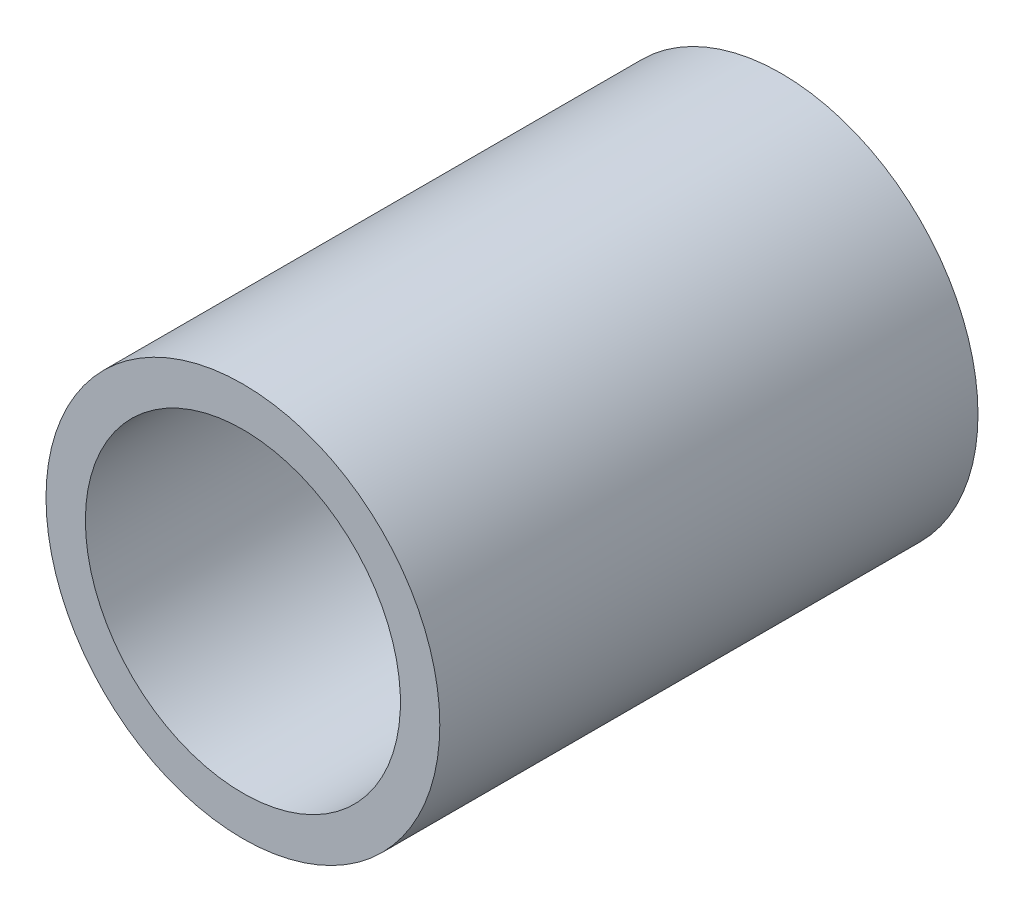
ISO-10303-21;
HEADER;
FILE_DESCRIPTION(('STEP AP214'),'2;1');
FILE_NAME('part.step','',(''),(''),'','','');
FILE_SCHEMA(('AUTOMOTIVE_DESIGN { 1 0 10303 214 1 1 1 1 }'));
ENDSEC;
DATA;
#1=APPLICATION_CONTEXT('core data for automotive mechanical design processes');
#2=APPLICATION_PROTOCOL_DEFINITION('international standard','automotive_design',2000,#1);
#3=PRODUCT_CONTEXT('',#1,'mechanical');
#4=PRODUCT('Part','Part','',(#3));
#5=PRODUCT_RELATED_PRODUCT_CATEGORY('part','',(#4));
#6=PRODUCT_DEFINITION_FORMATION('','',#4);
#7=PRODUCT_DEFINITION_CONTEXT('part definition',#1,'design');
#8=PRODUCT_DEFINITION('design','',#6,#7);
#9=PRODUCT_DEFINITION_SHAPE('','',#8);
#10=(LENGTH_UNIT() NAMED_UNIT(*) SI_UNIT(.MILLI.,.METRE.));
#11=(NAMED_UNIT(*) PLANE_ANGLE_UNIT() SI_UNIT($,.RADIAN.));
#12=(NAMED_UNIT(*) SI_UNIT($,.STERADIAN.) SOLID_ANGLE_UNIT());
#13=UNCERTAINTY_MEASURE_WITH_UNIT(LENGTH_MEASURE(1.E-05),#10,'distance_accuracy_value','');
#14=(GEOMETRIC_REPRESENTATION_CONTEXT(3) GLOBAL_UNCERTAINTY_ASSIGNED_CONTEXT((#13)) GLOBAL_UNIT_ASSIGNED_CONTEXT((#10,
#11,#12)) REPRESENTATION_CONTEXT('',''));
#15=CARTESIAN_POINT('',(0.,0.,0.));
#16=DIRECTION('',(0.,0.,1.));
#17=DIRECTION('',(1.,0.,0.));
#18=AXIS2_PLACEMENT_3D('',#15,#16,#17);
#19=CARTESIAN_POINT('',(0.,0.,10.25));
#20=DIRECTION('',(0.,0.,-1.));
#21=DIRECTION('',(-1.,0.,0.));
#22=AXIS2_PLACEMENT_3D('',#19,#20,#21);
#23=CYLINDRICAL_SURFACE('',#22,6.);
#24=CARTESIAN_POINT('',(0.,0.,-10.25));
#25=DIRECTION('',(0.,0.,-1.));
#26=DIRECTION('',(-1.,0.,0.));
#27=AXIS2_PLACEMENT_3D('',#24,#25,#26);
#28=CIRCLE('',#27,6.);
#29=CARTESIAN_POINT('',(-6.,0.,-10.25));
#30=VERTEX_POINT('',#29);
#31=EDGE_CURVE('E27',#30,#30,#28,.T.);
#32=ORIENTED_EDGE('',*,*,#31,.T.);
#33=EDGE_LOOP('',(#32));
#34=FACE_BOUND('',#33,.T.);
#35=CARTESIAN_POINT('',(0.,0.,10.25));
#36=DIRECTION('',(0.,0.,-1.));
#37=DIRECTION('',(-1.,0.,0.));
#38=AXIS2_PLACEMENT_3D('',#35,#36,#37);
#39=CIRCLE('',#38,6.);
#40=CARTESIAN_POINT('',(-6.,0.,10.25));
#41=VERTEX_POINT('',#40);
#42=EDGE_CURVE('E18',#41,#41,#39,.T.);
#43=ORIENTED_EDGE('',*,*,#42,.F.);
#44=EDGE_LOOP('',(#43));
#45=FACE_BOUND('',#44,.T.);
#46=ADVANCED_FACE('F15',(#34,#45),#23,.F.);
#47=CARTESIAN_POINT('',(0.,0.,10.25));
#48=DIRECTION('',(0.,0.,1.));
#49=DIRECTION('',(1.,0.,0.));
#50=AXIS2_PLACEMENT_3D('',#47,#48,#49);
#51=PLANE('',#50);
#52=ORIENTED_EDGE('',*,*,#42,.T.);
#53=EDGE_LOOP('',(#52));
#54=FACE_BOUND('',#53,.T.);
#55=CARTESIAN_POINT('',(0.,0.,10.25));
#56=DIRECTION('',(0.,0.,-1.));
#57=DIRECTION('',(-1.,0.,0.));
#58=AXIS2_PLACEMENT_3D('',#55,#56,#57);
#59=CIRCLE('',#58,7.5);
#60=CARTESIAN_POINT('',(-7.5,0.,10.25));
#61=VERTEX_POINT('',#60);
#62=EDGE_CURVE('E22',#61,#61,#59,.T.);
#63=ORIENTED_EDGE('',*,*,#62,.F.);
#64=EDGE_LOOP('',(#63));
#65=FACE_BOUND('',#64,.T.);
#66=ADVANCED_FACE('F35',(#54,#65),#51,.T.);
#67=CARTESIAN_POINT('',(0.,0.,-10.25));
#68=DIRECTION('',(0.,0.,1.));
#69=DIRECTION('',(1.,0.,0.));
#70=AXIS2_PLACEMENT_3D('',#67,#68,#69);
#71=PLANE('',#70);
#72=ORIENTED_EDGE('',*,*,#31,.F.);
#73=EDGE_LOOP('',(#72));
#74=FACE_BOUND('',#73,.T.);
#75=CARTESIAN_POINT('',(0.,0.,-10.25));
#76=DIRECTION('',(0.,0.,-1.));
#77=DIRECTION('',(-1.,0.,0.));
#78=AXIS2_PLACEMENT_3D('',#75,#76,#77);
#79=CIRCLE('',#78,7.5);
#80=CARTESIAN_POINT('',(-7.5,0.,-10.25));
#81=VERTEX_POINT('',#80);
#82=EDGE_CURVE('E10',#81,#81,#79,.F.);
#83=ORIENTED_EDGE('',*,*,#82,.F.);
#84=EDGE_LOOP('',(#83));
#85=FACE_BOUND('',#84,.T.);
#86=ADVANCED_FACE('F43',(#74,#85),#71,.F.);
#87=CARTESIAN_POINT('',(0.,0.,10.25));
#88=DIRECTION('',(0.,0.,-1.));
#89=DIRECTION('',(-1.,0.,0.));
#90=AXIS2_PLACEMENT_3D('',#87,#88,#89);
#91=CYLINDRICAL_SURFACE('',#90,7.5);
#92=ORIENTED_EDGE('',*,*,#82,.T.);
#93=EDGE_LOOP('',(#92));
#94=FACE_BOUND('',#93,.T.);
#95=ORIENTED_EDGE('',*,*,#62,.T.);
#96=EDGE_LOOP('',(#95));
#97=FACE_BOUND('',#96,.T.);
#98=ADVANCED_FACE('F44',(#94,#97),#91,.T.);
#99=CLOSED_SHELL('',(#46,#66,#86,#98));
#100=MANIFOLD_SOLID_BREP('B1',#99);
#101=ADVANCED_BREP_SHAPE_REPRESENTATION('',(#18,#100),#14);
#102=SHAPE_DEFINITION_REPRESENTATION(#9,#101);
ENDSEC;
END-ISO-10303-21;
